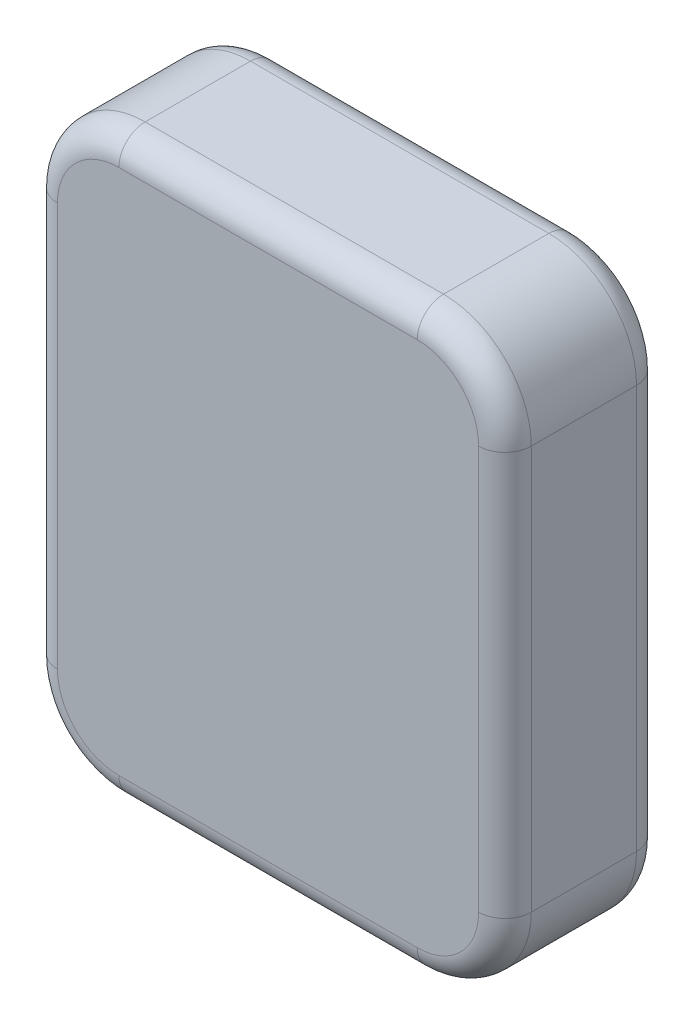
ISO-10303-21;
HEADER;
FILE_DESCRIPTION(('STEP AP214'),'2;1');
FILE_NAME('part.step','',(''),(''),'','','');
FILE_SCHEMA(('AUTOMOTIVE_DESIGN { 1 0 10303 214 1 1 1 1 }'));
ENDSEC;
DATA;
#1=APPLICATION_CONTEXT('core data for automotive mechanical design processes');
#2=APPLICATION_PROTOCOL_DEFINITION('international standard','automotive_design',2000,#1);
#3=PRODUCT_CONTEXT('',#1,'mechanical');
#4=PRODUCT('Part','Part','',(#3));
#5=PRODUCT_RELATED_PRODUCT_CATEGORY('part','',(#4));
#6=PRODUCT_DEFINITION_FORMATION('','',#4);
#7=PRODUCT_DEFINITION_CONTEXT('part definition',#1,'design');
#8=PRODUCT_DEFINITION('design','',#6,#7);
#9=PRODUCT_DEFINITION_SHAPE('','',#8);
#10=(LENGTH_UNIT() NAMED_UNIT(*) SI_UNIT(.MILLI.,.METRE.));
#11=(NAMED_UNIT(*) PLANE_ANGLE_UNIT() SI_UNIT($,.RADIAN.));
#12=(NAMED_UNIT(*) SI_UNIT($,.STERADIAN.) SOLID_ANGLE_UNIT());
#13=UNCERTAINTY_MEASURE_WITH_UNIT(LENGTH_MEASURE(1.E-05),#10,'distance_accuracy_value','');
#14=(GEOMETRIC_REPRESENTATION_CONTEXT(3) GLOBAL_UNCERTAINTY_ASSIGNED_CONTEXT((#13)) GLOBAL_UNIT_ASSIGNED_CONTEXT((#10,
#11,#12)) REPRESENTATION_CONTEXT('',''));
#15=CARTESIAN_POINT('',(0.,0.,0.));
#16=DIRECTION('',(0.,0.,1.));
#17=DIRECTION('',(1.,0.,0.));
#18=AXIS2_PLACEMENT_3D('',#15,#16,#17);
#19=CARTESIAN_POINT('',(0.,0.,18.));
#20=DIRECTION('',(1.,0.,0.));
#21=DIRECTION('',(0.,1.,0.));
#22=AXIS2_PLACEMENT_3D('',#19,#20,#21);
#23=PLANE('',#22);
#24=DIRECTION('',(0.,0.,-1.));
#25=VECTOR('',#24,1.);
#26=CARTESIAN_POINT('',(0.,56.,18.));
#27=LINE('',#26,#25);
#28=CARTESIAN_POINT('',(0.,56.,15.));
#29=VERTEX_POINT('',#28);
#30=CARTESIAN_POINT('',(0.,56.,3.));
#31=VERTEX_POINT('',#30);
#32=EDGE_CURVE('E344',#29,#31,#27,.T.);
#33=ORIENTED_EDGE('',*,*,#32,.T.);
#34=DIRECTION('',(0.,-1.,0.));
#35=VECTOR('',#34,1.);
#36=CARTESIAN_POINT('',(0.,10.,3.));
#37=LINE('',#36,#35);
#38=CARTESIAN_POINT('',(0.,10.,3.));
#39=VERTEX_POINT('',#38);
#40=EDGE_CURVE('E231',#31,#39,#37,.T.);
#41=ORIENTED_EDGE('',*,*,#40,.T.);
#42=DIRECTION('',(0.,0.,-1.));
#43=VECTOR('',#42,1.);
#44=CARTESIAN_POINT('',(0.,10.,18.));
#45=LINE('',#44,#43);
#46=CARTESIAN_POINT('',(0.,10.,15.));
#47=VERTEX_POINT('',#46);
#48=EDGE_CURVE('E350',#39,#47,#45,.F.);
#49=ORIENTED_EDGE('',*,*,#48,.T.);
#50=DIRECTION('',(0.,-1.,0.));
#51=VECTOR('',#50,1.);
#52=CARTESIAN_POINT('',(0.,0.,15.));
#53=LINE('',#52,#51);
#54=EDGE_CURVE('E228',#47,#29,#53,.F.);
#55=ORIENTED_EDGE('',*,*,#54,.T.);
#56=EDGE_LOOP('',(#33,#41,#49,#55));
#57=FACE_BOUND('',#56,.T.);
#58=ADVANCED_FACE('F49',(#57),#23,.F.);
#59=CARTESIAN_POINT('',(0.,0.,18.));
#60=DIRECTION('',(0.,1.,0.));
#61=DIRECTION('',(0.,0.,1.));
#62=AXIS2_PLACEMENT_3D('',#59,#60,#61);
#63=PLANE('',#62);
#64=DIRECTION('',(0.,0.,-1.));
#65=VECTOR('',#64,1.);
#66=CARTESIAN_POINT('',(10.,0.,18.));
#67=LINE('',#66,#65);
#68=CARTESIAN_POINT('',(10.,0.,15.));
#69=VERTEX_POINT('',#68);
#70=CARTESIAN_POINT('',(10.,0.,3.));
#71=VERTEX_POINT('',#70);
#72=EDGE_CURVE('E341',#69,#71,#67,.T.);
#73=ORIENTED_EDGE('',*,*,#72,.T.);
#74=DIRECTION('',(1.,0.,0.));
#75=VECTOR('',#74,1.);
#76=CARTESIAN_POINT('',(44.,0.,3.));
#77=LINE('',#76,#75);
#78=CARTESIAN_POINT('',(44.,0.,3.));
#79=VERTEX_POINT('',#78);
#80=EDGE_CURVE('E243',#71,#79,#77,.T.);
#81=ORIENTED_EDGE('',*,*,#80,.T.);
#82=DIRECTION('',(0.,0.,-1.));
#83=VECTOR('',#82,1.);
#84=CARTESIAN_POINT('',(44.,0.,18.));
#85=LINE('',#84,#83);
#86=CARTESIAN_POINT('',(44.,0.,15.));
#87=VERTEX_POINT('',#86);
#88=EDGE_CURVE('E289',#79,#87,#85,.F.);
#89=ORIENTED_EDGE('',*,*,#88,.T.);
#90=DIRECTION('',(1.,0.,0.));
#91=VECTOR('',#90,1.);
#92=CARTESIAN_POINT('',(0.,0.,15.));
#93=LINE('',#92,#91);
#94=EDGE_CURVE('E240',#87,#69,#93,.F.);
#95=ORIENTED_EDGE('',*,*,#94,.T.);
#96=EDGE_LOOP('',(#73,#81,#89,#95));
#97=FACE_BOUND('',#96,.T.);
#98=ADVANCED_FACE('F338',(#97),#63,.F.);
#99=CARTESIAN_POINT('',(54.,0.,18.));
#100=DIRECTION('',(-1.,0.,0.));
#101=DIRECTION('',(0.,-1.,0.));
#102=AXIS2_PLACEMENT_3D('',#99,#100,#101);
#103=PLANE('',#102);
#104=DIRECTION('',(0.,0.,-1.));
#105=VECTOR('',#104,1.);
#106=CARTESIAN_POINT('',(54.,10.,18.));
#107=LINE('',#106,#105);
#108=CARTESIAN_POINT('',(54.,10.,15.));
#109=VERTEX_POINT('',#108);
#110=CARTESIAN_POINT('',(54.,10.,3.));
#111=VERTEX_POINT('',#110);
#112=EDGE_CURVE('E335',#109,#111,#107,.T.);
#113=ORIENTED_EDGE('',*,*,#112,.T.);
#114=DIRECTION('',(0.,1.,0.));
#115=VECTOR('',#114,1.);
#116=CARTESIAN_POINT('',(54.,56.,3.));
#117=LINE('',#116,#115);
#118=CARTESIAN_POINT('',(54.,56.,3.));
#119=VERTEX_POINT('',#118);
#120=EDGE_CURVE('E206',#111,#119,#117,.T.);
#121=ORIENTED_EDGE('',*,*,#120,.T.);
#122=DIRECTION('',(0.,0.,-1.));
#123=VECTOR('',#122,1.);
#124=CARTESIAN_POINT('',(54.,56.,18.));
#125=LINE('',#124,#123);
#126=CARTESIAN_POINT('',(54.,56.,15.));
#127=VERTEX_POINT('',#126);
#128=EDGE_CURVE('E354',#119,#127,#125,.F.);
#129=ORIENTED_EDGE('',*,*,#128,.T.);
#130=DIRECTION('',(0.,1.,0.));
#131=VECTOR('',#130,1.);
#132=CARTESIAN_POINT('',(54.,0.,15.));
#133=LINE('',#132,#131);
#134=EDGE_CURVE('E203',#127,#109,#133,.F.);
#135=ORIENTED_EDGE('',*,*,#134,.T.);
#136=EDGE_LOOP('',(#113,#121,#129,#135));
#137=FACE_BOUND('',#136,.T.);
#138=ADVANCED_FACE('F390',(#137),#103,.F.);
#139=CARTESIAN_POINT('',(0.,66.,18.));
#140=DIRECTION('',(0.,-1.,0.));
#141=DIRECTION('',(0.,0.,-1.));
#142=AXIS2_PLACEMENT_3D('',#139,#140,#141);
#143=PLANE('',#142);
#144=DIRECTION('',(0.,0.,-1.));
#145=VECTOR('',#144,1.);
#146=CARTESIAN_POINT('',(44.,66.,18.));
#147=LINE('',#146,#145);
#148=CARTESIAN_POINT('',(44.,66.,15.));
#149=VERTEX_POINT('',#148);
#150=CARTESIAN_POINT('',(44.,66.,3.));
#151=VERTEX_POINT('',#150);
#152=EDGE_CURVE('E185',#149,#151,#147,.T.);
#153=ORIENTED_EDGE('',*,*,#152,.T.);
#154=DIRECTION('',(-1.,0.,0.));
#155=VECTOR('',#154,1.);
#156=CARTESIAN_POINT('',(9.99999999999999,66.,3.));
#157=LINE('',#156,#155);
#158=CARTESIAN_POINT('',(9.99999999999999,66.,3.));
#159=VERTEX_POINT('',#158);
#160=EDGE_CURVE('E218',#151,#159,#157,.T.);
#161=ORIENTED_EDGE('',*,*,#160,.T.);
#162=DIRECTION('',(0.,0.,-1.));
#163=VECTOR('',#162,1.);
#164=CARTESIAN_POINT('',(9.99999999999999,66.,18.));
#165=LINE('',#164,#163);
#166=CARTESIAN_POINT('',(9.99999999999999,66.,15.));
#167=VERTEX_POINT('',#166);
#168=EDGE_CURVE('E360',#159,#167,#165,.F.);
#169=ORIENTED_EDGE('',*,*,#168,.T.);
#170=DIRECTION('',(-1.,0.,0.));
#171=VECTOR('',#170,1.);
#172=CARTESIAN_POINT('',(0.,66.,15.));
#173=LINE('',#172,#171);
#174=EDGE_CURVE('E215',#167,#149,#173,.F.);
#175=ORIENTED_EDGE('',*,*,#174,.T.);
#176=EDGE_LOOP('',(#153,#161,#169,#175));
#177=FACE_BOUND('',#176,.T.);
#178=ADVANCED_FACE('F433',(#177),#143,.F.);
#179=CARTESIAN_POINT('',(0.,0.,18.));
#180=DIRECTION('',(0.,0.,-1.));
#181=DIRECTION('',(-1.,0.,0.));
#182=AXIS2_PLACEMENT_3D('',#179,#180,#181);
#183=PLANE('',#182);
#184=DIRECTION('',(-1.,0.,0.));
#185=VECTOR('',#184,1.);
#186=CARTESIAN_POINT('',(0.,63.,18.));
#187=LINE('',#186,#185);
#188=CARTESIAN_POINT('',(44.,63.,18.));
#189=VERTEX_POINT('',#188);
#190=CARTESIAN_POINT('',(9.99999999999999,63.,18.));
#191=VERTEX_POINT('',#190);
#192=EDGE_CURVE('E59',#189,#191,#187,.T.);
#193=ORIENTED_EDGE('',*,*,#192,.T.);
#194=CARTESIAN_POINT('',(9.99999999999999,56.,18.));
#195=DIRECTION('',(0.,0.,-1.));
#196=DIRECTION('',(-1.,0.,0.));
#197=AXIS2_PLACEMENT_3D('',#194,#195,#196);
#198=CIRCLE('',#197,7.);
#199=CARTESIAN_POINT('',(2.99999999999999,56.,18.));
#200=VERTEX_POINT('',#199);
#201=EDGE_CURVE('E11',#191,#200,#198,.F.);
#202=ORIENTED_EDGE('',*,*,#201,.T.);
#203=DIRECTION('',(0.,-1.,0.));
#204=VECTOR('',#203,1.);
#205=CARTESIAN_POINT('',(3.,0.,18.));
#206=LINE('',#205,#204);
#207=CARTESIAN_POINT('',(3.,10.,18.));
#208=VERTEX_POINT('',#207);
#209=EDGE_CURVE('E246',#200,#208,#206,.T.);
#210=ORIENTED_EDGE('',*,*,#209,.T.);
#211=CARTESIAN_POINT('',(10.,10.,18.));
#212=DIRECTION('',(0.,0.,-1.));
#213=DIRECTION('',(-1.,0.,0.));
#214=AXIS2_PLACEMENT_3D('',#211,#212,#213);
#215=CIRCLE('',#214,7.);
#216=CARTESIAN_POINT('',(10.,3.,18.));
#217=VERTEX_POINT('',#216);
#218=EDGE_CURVE('E249',#208,#217,#215,.F.);
#219=ORIENTED_EDGE('',*,*,#218,.T.);
#220=DIRECTION('',(1.,0.,0.));
#221=VECTOR('',#220,1.);
#222=CARTESIAN_POINT('',(0.,3.,18.));
#223=LINE('',#222,#221);
#224=CARTESIAN_POINT('',(44.,3.,18.));
#225=VERTEX_POINT('',#224);
#226=EDGE_CURVE('E252',#217,#225,#223,.T.);
#227=ORIENTED_EDGE('',*,*,#226,.T.);
#228=CARTESIAN_POINT('',(44.,10.,18.));
#229=DIRECTION('',(0.,0.,-1.));
#230=DIRECTION('',(-1.,0.,0.));
#231=AXIS2_PLACEMENT_3D('',#228,#229,#230);
#232=CIRCLE('',#231,7.);
#233=CARTESIAN_POINT('',(51.,10.,18.));
#234=VERTEX_POINT('',#233);
#235=EDGE_CURVE('E255',#225,#234,#232,.F.);
#236=ORIENTED_EDGE('',*,*,#235,.T.);
#237=DIRECTION('',(0.,1.,0.));
#238=VECTOR('',#237,1.);
#239=CARTESIAN_POINT('',(51.,0.,18.));
#240=LINE('',#239,#238);
#241=CARTESIAN_POINT('',(51.,56.,18.));
#242=VERTEX_POINT('',#241);
#243=EDGE_CURVE('E258',#234,#242,#240,.T.);
#244=ORIENTED_EDGE('',*,*,#243,.T.);
#245=CARTESIAN_POINT('',(44.,56.,18.));
#246=DIRECTION('',(0.,0.,-1.));
#247=DIRECTION('',(-1.,0.,0.));
#248=AXIS2_PLACEMENT_3D('',#245,#246,#247);
#249=CIRCLE('',#248,7.);
#250=EDGE_CURVE('E70',#242,#189,#249,.F.);
#251=ORIENTED_EDGE('',*,*,#250,.T.);
#252=EDGE_LOOP('',(#193,#202,#210,#219,#227,#236,#244,#251));
#253=FACE_BOUND('',#252,.T.);
#254=ADVANCED_FACE('F406',(#253),#183,.F.);
#255=CARTESIAN_POINT('',(0.,0.,0.));
#256=DIRECTION('',(0.,0.,-1.));
#257=DIRECTION('',(-1.,0.,0.));
#258=AXIS2_PLACEMENT_3D('',#255,#256,#257);
#259=PLANE('',#258);
#260=DIRECTION('',(0.,1.,0.));
#261=VECTOR('',#260,1.);
#262=CARTESIAN_POINT('',(51.,10.,0.));
#263=LINE('',#262,#261);
#264=CARTESIAN_POINT('',(51.,56.,0.));
#265=VERTEX_POINT('',#264);
#266=CARTESIAN_POINT('',(51.,10.,0.));
#267=VERTEX_POINT('',#266);
#268=EDGE_CURVE('E189',#265,#267,#263,.F.);
#269=ORIENTED_EDGE('',*,*,#268,.T.);
#270=CARTESIAN_POINT('',(44.,10.,0.));
#271=DIRECTION('',(0.,0.,-1.));
#272=DIRECTION('',(-1.,0.,0.));
#273=AXIS2_PLACEMENT_3D('',#270,#271,#272);
#274=CIRCLE('',#273,7.);
#275=CARTESIAN_POINT('',(44.,3.,0.));
#276=VERTEX_POINT('',#275);
#277=EDGE_CURVE('E168',#267,#276,#274,.T.);
#278=ORIENTED_EDGE('',*,*,#277,.T.);
#279=DIRECTION('',(1.,0.,0.));
#280=VECTOR('',#279,1.);
#281=CARTESIAN_POINT('',(10.,3.,0.));
#282=LINE('',#281,#280);
#283=CARTESIAN_POINT('',(10.,3.,0.));
#284=VERTEX_POINT('',#283);
#285=EDGE_CURVE('E177',#276,#284,#282,.F.);
#286=ORIENTED_EDGE('',*,*,#285,.T.);
#287=CARTESIAN_POINT('',(10.,10.,0.));
#288=DIRECTION('',(0.,0.,-1.));
#289=DIRECTION('',(-1.,0.,0.));
#290=AXIS2_PLACEMENT_3D('',#287,#288,#289);
#291=CIRCLE('',#290,7.);
#292=CARTESIAN_POINT('',(3.,10.,0.));
#293=VERTEX_POINT('',#292);
#294=EDGE_CURVE('E184',#284,#293,#291,.T.);
#295=ORIENTED_EDGE('',*,*,#294,.T.);
#296=DIRECTION('',(0.,-1.,0.));
#297=VECTOR('',#296,1.);
#298=CARTESIAN_POINT('',(2.99999999999999,56.,0.));
#299=LINE('',#298,#297);
#300=CARTESIAN_POINT('',(2.99999999999999,56.,0.));
#301=VERTEX_POINT('',#300);
#302=EDGE_CURVE('E369',#293,#301,#299,.F.);
#303=ORIENTED_EDGE('',*,*,#302,.T.);
#304=CARTESIAN_POINT('',(9.99999999999999,56.,0.));
#305=DIRECTION('',(0.,0.,-1.));
#306=DIRECTION('',(-1.,0.,0.));
#307=AXIS2_PLACEMENT_3D('',#304,#305,#306);
#308=CIRCLE('',#307,7.);
#309=CARTESIAN_POINT('',(9.99999999999999,63.,0.));
#310=VERTEX_POINT('',#309);
#311=EDGE_CURVE('E372',#301,#310,#308,.T.);
#312=ORIENTED_EDGE('',*,*,#311,.T.);
#313=DIRECTION('',(-1.,0.,0.));
#314=VECTOR('',#313,1.);
#315=CARTESIAN_POINT('',(44.,63.,0.));
#316=LINE('',#315,#314);
#317=CARTESIAN_POINT('',(44.,63.,0.));
#318=VERTEX_POINT('',#317);
#319=EDGE_CURVE('E375',#310,#318,#316,.F.);
#320=ORIENTED_EDGE('',*,*,#319,.T.);
#321=CARTESIAN_POINT('',(44.,56.,0.));
#322=DIRECTION('',(0.,0.,-1.));
#323=DIRECTION('',(-1.,0.,0.));
#324=AXIS2_PLACEMENT_3D('',#321,#322,#323);
#325=CIRCLE('',#324,7.);
#326=EDGE_CURVE('E197',#318,#265,#325,.T.);
#327=ORIENTED_EDGE('',*,*,#326,.T.);
#328=EDGE_LOOP('',(#269,#278,#286,#295,#303,#312,#320,#327));
#329=FACE_BOUND('',#328,.T.);
#330=ADVANCED_FACE('F187',(#329),#259,.T.);
#331=CARTESIAN_POINT('',(10.,10.,18.));
#332=DIRECTION('',(0.,0.,-1.));
#333=DIRECTION('',(-1.,0.,0.));
#334=AXIS2_PLACEMENT_3D('',#331,#332,#333);
#335=CYLINDRICAL_SURFACE('',#334,10.);
#336=ORIENTED_EDGE('',*,*,#48,.F.);
#337=CARTESIAN_POINT('',(10.,10.,3.));
#338=DIRECTION('',(0.,0.,-1.));
#339=DIRECTION('',(-1.,0.,0.));
#340=AXIS2_PLACEMENT_3D('',#337,#338,#339);
#341=CIRCLE('',#340,10.);
#342=EDGE_CURVE('E237',#39,#71,#341,.F.);
#343=ORIENTED_EDGE('',*,*,#342,.T.);
#344=ORIENTED_EDGE('',*,*,#72,.F.);
#345=CARTESIAN_POINT('',(10.,10.,15.));
#346=DIRECTION('',(0.,0.,-1.));
#347=DIRECTION('',(-1.,0.,0.));
#348=AXIS2_PLACEMENT_3D('',#345,#346,#347);
#349=CIRCLE('',#348,10.);
#350=EDGE_CURVE('E234',#69,#47,#349,.T.);
#351=ORIENTED_EDGE('',*,*,#350,.T.);
#352=EDGE_LOOP('',(#336,#343,#344,#351));
#353=FACE_BOUND('',#352,.T.);
#354=ADVANCED_FACE('F450',(#353),#335,.T.);
#355=CARTESIAN_POINT('',(44.,10.,18.));
#356=DIRECTION('',(0.,0.,-1.));
#357=DIRECTION('',(-1.,0.,0.));
#358=AXIS2_PLACEMENT_3D('',#355,#356,#357);
#359=CYLINDRICAL_SURFACE('',#358,10.);
#360=ORIENTED_EDGE('',*,*,#88,.F.);
#361=CARTESIAN_POINT('',(44.,10.,3.));
#362=DIRECTION('',(0.,0.,-1.));
#363=DIRECTION('',(-1.,0.,0.));
#364=AXIS2_PLACEMENT_3D('',#361,#362,#363);
#365=CIRCLE('',#364,10.);
#366=EDGE_CURVE('E170',#79,#111,#365,.F.);
#367=ORIENTED_EDGE('',*,*,#366,.T.);
#368=ORIENTED_EDGE('',*,*,#112,.F.);
#369=CARTESIAN_POINT('',(44.,10.,15.));
#370=DIRECTION('',(0.,0.,-1.));
#371=DIRECTION('',(-1.,0.,0.));
#372=AXIS2_PLACEMENT_3D('',#369,#370,#371);
#373=CIRCLE('',#372,10.);
#374=EDGE_CURVE('E192',#109,#87,#373,.T.);
#375=ORIENTED_EDGE('',*,*,#374,.T.);
#376=EDGE_LOOP('',(#360,#367,#368,#375));
#377=FACE_BOUND('',#376,.T.);
#378=ADVANCED_FACE('F333',(#377),#359,.T.);
#379=CARTESIAN_POINT('',(44.,56.,18.));
#380=DIRECTION('',(0.,0.,-1.));
#381=DIRECTION('',(-1.,0.,0.));
#382=AXIS2_PLACEMENT_3D('',#379,#380,#381);
#383=CYLINDRICAL_SURFACE('',#382,10.);
#384=ORIENTED_EDGE('',*,*,#128,.F.);
#385=CARTESIAN_POINT('',(44.,56.,3.));
#386=DIRECTION('',(0.,0.,-1.));
#387=DIRECTION('',(-1.,0.,0.));
#388=AXIS2_PLACEMENT_3D('',#385,#386,#387);
#389=CIRCLE('',#388,10.);
#390=EDGE_CURVE('E212',#119,#151,#389,.F.);
#391=ORIENTED_EDGE('',*,*,#390,.T.);
#392=ORIENTED_EDGE('',*,*,#152,.F.);
#393=CARTESIAN_POINT('',(44.,56.,15.));
#394=DIRECTION('',(0.,0.,-1.));
#395=DIRECTION('',(-1.,0.,0.));
#396=AXIS2_PLACEMENT_3D('',#393,#394,#395);
#397=CIRCLE('',#396,10.);
#398=EDGE_CURVE('E209',#149,#127,#397,.T.);
#399=ORIENTED_EDGE('',*,*,#398,.T.);
#400=EDGE_LOOP('',(#384,#391,#392,#399));
#401=FACE_BOUND('',#400,.T.);
#402=ADVANCED_FACE('F392',(#401),#383,.T.);
#403=CARTESIAN_POINT('',(9.99999999999999,56.,18.));
#404=DIRECTION('',(0.,0.,-1.));
#405=DIRECTION('',(-1.,0.,0.));
#406=AXIS2_PLACEMENT_3D('',#403,#404,#405);
#407=CYLINDRICAL_SURFACE('',#406,10.);
#408=ORIENTED_EDGE('',*,*,#168,.F.);
#409=CARTESIAN_POINT('',(9.99999999999999,56.,3.));
#410=DIRECTION('',(0.,0.,-1.));
#411=DIRECTION('',(-1.,0.,0.));
#412=AXIS2_PLACEMENT_3D('',#409,#410,#411);
#413=CIRCLE('',#412,10.);
#414=EDGE_CURVE('E225',#159,#31,#413,.F.);
#415=ORIENTED_EDGE('',*,*,#414,.T.);
#416=ORIENTED_EDGE('',*,*,#32,.F.);
#417=CARTESIAN_POINT('',(9.99999999999999,56.,15.));
#418=DIRECTION('',(0.,0.,-1.));
#419=DIRECTION('',(-1.,0.,0.));
#420=AXIS2_PLACEMENT_3D('',#417,#418,#419);
#421=CIRCLE('',#420,10.);
#422=EDGE_CURVE('E221',#29,#167,#421,.T.);
#423=ORIENTED_EDGE('',*,*,#422,.T.);
#424=EDGE_LOOP('',(#408,#415,#416,#423));
#425=FACE_BOUND('',#424,.T.);
#426=ADVANCED_FACE('F422',(#425),#407,.T.);
#427=CARTESIAN_POINT('',(9.99999999999999,56.,3.));
#428=DIRECTION('',(0.,0.,-1.));
#429=DIRECTION('',(-1.,0.,0.));
#430=AXIS2_PLACEMENT_3D('',#427,#428,#429);
#431=TOROIDAL_SURFACE('',#430,7.,3.);
#432=CARTESIAN_POINT('',(2.99999999999999,56.,3.));
#433=DIRECTION('',(0.,-1.,0.));
#434=DIRECTION('',(0.,0.,-1.));
#435=AXIS2_PLACEMENT_3D('',#432,#433,#434);
#436=CIRCLE('',#435,3.);
#437=EDGE_CURVE('E281',#31,#301,#436,.T.);
#438=ORIENTED_EDGE('',*,*,#437,.F.);
#439=ORIENTED_EDGE('',*,*,#414,.F.);
#440=CARTESIAN_POINT('',(9.99999999999999,63.,3.));
#441=DIRECTION('',(1.,0.,0.));
#442=DIRECTION('',(0.,0.,-1.));
#443=AXIS2_PLACEMENT_3D('',#440,#441,#442);
#444=CIRCLE('',#443,3.);
#445=EDGE_CURVE('E285',#310,#159,#444,.T.);
#446=ORIENTED_EDGE('',*,*,#445,.F.);
#447=ORIENTED_EDGE('',*,*,#311,.F.);
#448=EDGE_LOOP('',(#438,#439,#446,#447));
#449=FACE_BOUND('',#448,.T.);
#450=ADVANCED_FACE('F426',(#449),#431,.T.);
#451=CARTESIAN_POINT('',(0.,63.,3.));
#452=DIRECTION('',(1.,0.,0.));
#453=DIRECTION('',(0.,0.,-1.));
#454=AXIS2_PLACEMENT_3D('',#451,#452,#453);
#455=CYLINDRICAL_SURFACE('',#454,3.);
#456=ORIENTED_EDGE('',*,*,#445,.T.);
#457=ORIENTED_EDGE('',*,*,#160,.F.);
#458=CARTESIAN_POINT('',(44.,63.,3.));
#459=DIRECTION('',(1.,0.,0.));
#460=DIRECTION('',(0.,0.,-1.));
#461=AXIS2_PLACEMENT_3D('',#458,#459,#460);
#462=CIRCLE('',#461,3.);
#463=EDGE_CURVE('E277',#318,#151,#462,.T.);
#464=ORIENTED_EDGE('',*,*,#463,.F.);
#465=ORIENTED_EDGE('',*,*,#319,.F.);
#466=EDGE_LOOP('',(#456,#457,#464,#465));
#467=FACE_BOUND('',#466,.T.);
#468=ADVANCED_FACE('F431',(#467),#455,.T.);
#469=CARTESIAN_POINT('',(3.,0.,3.));
#470=DIRECTION('',(0.,1.,0.));
#471=DIRECTION('',(-1.,0.,0.));
#472=AXIS2_PLACEMENT_3D('',#469,#470,#471);
#473=CYLINDRICAL_SURFACE('',#472,3.);
#474=ORIENTED_EDGE('',*,*,#437,.T.);
#475=ORIENTED_EDGE('',*,*,#302,.F.);
#476=CARTESIAN_POINT('',(3.,10.,3.));
#477=DIRECTION('',(0.,-1.,0.));
#478=DIRECTION('',(0.,0.,-1.));
#479=AXIS2_PLACEMENT_3D('',#476,#477,#478);
#480=CIRCLE('',#479,3.);
#481=EDGE_CURVE('E273',#39,#293,#480,.T.);
#482=ORIENTED_EDGE('',*,*,#481,.F.);
#483=ORIENTED_EDGE('',*,*,#40,.F.);
#484=EDGE_LOOP('',(#474,#475,#482,#483));
#485=FACE_BOUND('',#484,.T.);
#486=ADVANCED_FACE('F472',(#485),#473,.T.);
#487=CARTESIAN_POINT('',(44.,56.,3.));
#488=DIRECTION('',(0.,0.,-1.));
#489=DIRECTION('',(-1.,0.,0.));
#490=AXIS2_PLACEMENT_3D('',#487,#488,#489);
#491=TOROIDAL_SURFACE('',#490,7.,3.);
#492=ORIENTED_EDGE('',*,*,#463,.T.);
#493=ORIENTED_EDGE('',*,*,#390,.F.);
#494=CARTESIAN_POINT('',(51.,56.,3.));
#495=DIRECTION('',(0.,-1.,0.));
#496=DIRECTION('',(0.,0.,-1.));
#497=AXIS2_PLACEMENT_3D('',#494,#495,#496);
#498=CIRCLE('',#497,3.);
#499=EDGE_CURVE('E269',#265,#119,#498,.T.);
#500=ORIENTED_EDGE('',*,*,#499,.F.);
#501=ORIENTED_EDGE('',*,*,#326,.F.);
#502=EDGE_LOOP('',(#492,#493,#500,#501));
#503=FACE_BOUND('',#502,.T.);
#504=ADVANCED_FACE('F384',(#503),#491,.T.);
#505=CARTESIAN_POINT('',(10.,10.,3.));
#506=DIRECTION('',(0.,0.,-1.));
#507=DIRECTION('',(-1.,0.,0.));
#508=AXIS2_PLACEMENT_3D('',#505,#506,#507);
#509=TOROIDAL_SURFACE('',#508,7.,3.);
#510=ORIENTED_EDGE('',*,*,#481,.T.);
#511=ORIENTED_EDGE('',*,*,#294,.F.);
#512=CARTESIAN_POINT('',(10.,3.,3.));
#513=DIRECTION('',(1.,0.,0.));
#514=DIRECTION('',(0.,0.,-1.));
#515=AXIS2_PLACEMENT_3D('',#512,#513,#514);
#516=CIRCLE('',#515,3.);
#517=EDGE_CURVE('E180',#71,#284,#516,.T.);
#518=ORIENTED_EDGE('',*,*,#517,.F.);
#519=ORIENTED_EDGE('',*,*,#342,.F.);
#520=EDGE_LOOP('',(#510,#511,#518,#519));
#521=FACE_BOUND('',#520,.T.);
#522=ADVANCED_FACE('F466',(#521),#509,.T.);
#523=CARTESIAN_POINT('',(51.,0.,3.));
#524=DIRECTION('',(0.,-1.,0.));
#525=DIRECTION('',(1.,0.,0.));
#526=AXIS2_PLACEMENT_3D('',#523,#524,#525);
#527=CYLINDRICAL_SURFACE('',#526,3.);
#528=ORIENTED_EDGE('',*,*,#499,.T.);
#529=ORIENTED_EDGE('',*,*,#120,.F.);
#530=CARTESIAN_POINT('',(51.,10.,3.));
#531=DIRECTION('',(0.,-1.,0.));
#532=DIRECTION('',(0.,0.,-1.));
#533=AXIS2_PLACEMENT_3D('',#530,#531,#532);
#534=CIRCLE('',#533,3.);
#535=EDGE_CURVE('E174',#267,#111,#534,.T.);
#536=ORIENTED_EDGE('',*,*,#535,.F.);
#537=ORIENTED_EDGE('',*,*,#268,.F.);
#538=EDGE_LOOP('',(#528,#529,#536,#537));
#539=FACE_BOUND('',#538,.T.);
#540=ADVANCED_FACE('F387',(#539),#527,.T.);
#541=CARTESIAN_POINT('',(0.,3.,3.));
#542=DIRECTION('',(-1.,0.,0.));
#543=DIRECTION('',(0.,0.,1.));
#544=AXIS2_PLACEMENT_3D('',#541,#542,#543);
#545=CYLINDRICAL_SURFACE('',#544,3.);
#546=ORIENTED_EDGE('',*,*,#517,.T.);
#547=ORIENTED_EDGE('',*,*,#285,.F.);
#548=CARTESIAN_POINT('',(44.,3.,3.));
#549=DIRECTION('',(1.,0.,0.));
#550=DIRECTION('',(0.,0.,-1.));
#551=AXIS2_PLACEMENT_3D('',#548,#549,#550);
#552=CIRCLE('',#551,3.);
#553=EDGE_CURVE('E164',#79,#276,#552,.T.);
#554=ORIENTED_EDGE('',*,*,#553,.F.);
#555=ORIENTED_EDGE('',*,*,#80,.F.);
#556=EDGE_LOOP('',(#546,#547,#554,#555));
#557=FACE_BOUND('',#556,.T.);
#558=ADVANCED_FACE('F178',(#557),#545,.T.);
#559=CARTESIAN_POINT('',(44.,10.,3.));
#560=DIRECTION('',(0.,0.,-1.));
#561=DIRECTION('',(-1.,0.,0.));
#562=AXIS2_PLACEMENT_3D('',#559,#560,#561);
#563=TOROIDAL_SURFACE('',#562,7.,3.);
#564=ORIENTED_EDGE('',*,*,#535,.T.);
#565=ORIENTED_EDGE('',*,*,#366,.F.);
#566=ORIENTED_EDGE('',*,*,#553,.T.);
#567=ORIENTED_EDGE('',*,*,#277,.F.);
#568=EDGE_LOOP('',(#564,#565,#566,#567));
#569=FACE_BOUND('',#568,.T.);
#570=ADVANCED_FACE('F166',(#569),#563,.T.);
#571=CARTESIAN_POINT('',(44.,10.,15.));
#572=DIRECTION('',(0.,0.,-1.));
#573=DIRECTION('',(-1.,0.,0.));
#574=AXIS2_PLACEMENT_3D('',#571,#572,#573);
#575=TOROIDAL_SURFACE('',#574,7.,3.);
#576=CARTESIAN_POINT('',(44.,3.,15.));
#577=DIRECTION('',(-1.,0.,0.));
#578=DIRECTION('',(0.,0.,1.));
#579=AXIS2_PLACEMENT_3D('',#576,#577,#578);
#580=CIRCLE('',#579,3.);
#581=EDGE_CURVE('E311',#87,#225,#580,.T.);
#582=ORIENTED_EDGE('',*,*,#581,.F.);
#583=ORIENTED_EDGE('',*,*,#374,.F.);
#584=CARTESIAN_POINT('',(51.,10.,15.));
#585=DIRECTION('',(0.,1.,0.));
#586=DIRECTION('',(0.,0.,1.));
#587=AXIS2_PLACEMENT_3D('',#584,#585,#586);
#588=CIRCLE('',#587,3.);
#589=EDGE_CURVE('E53',#234,#109,#588,.T.);
#590=ORIENTED_EDGE('',*,*,#589,.F.);
#591=ORIENTED_EDGE('',*,*,#235,.F.);
#592=EDGE_LOOP('',(#582,#583,#590,#591));
#593=FACE_BOUND('',#592,.T.);
#594=ADVANCED_FACE('F51',(#593),#575,.T.);
#595=CARTESIAN_POINT('',(51.,0.,15.));
#596=DIRECTION('',(0.,1.,0.));
#597=DIRECTION('',(-1.,0.,0.));
#598=AXIS2_PLACEMENT_3D('',#595,#596,#597);
#599=CYLINDRICAL_SURFACE('',#598,3.);
#600=ORIENTED_EDGE('',*,*,#589,.T.);
#601=ORIENTED_EDGE('',*,*,#134,.F.);
#602=CARTESIAN_POINT('',(51.,56.,15.));
#603=DIRECTION('',(0.,1.,0.));
#604=DIRECTION('',(0.,0.,1.));
#605=AXIS2_PLACEMENT_3D('',#602,#603,#604);
#606=CIRCLE('',#605,3.);
#607=EDGE_CURVE('E308',#242,#127,#606,.T.);
#608=ORIENTED_EDGE('',*,*,#607,.F.);
#609=ORIENTED_EDGE('',*,*,#243,.F.);
#610=EDGE_LOOP('',(#600,#601,#608,#609));
#611=FACE_BOUND('',#610,.T.);
#612=ADVANCED_FACE('F324',(#611),#599,.T.);
#613=CARTESIAN_POINT('',(0.,3.,15.));
#614=DIRECTION('',(1.,0.,0.));
#615=DIRECTION('',(0.,0.,-1.));
#616=AXIS2_PLACEMENT_3D('',#613,#614,#615);
#617=CYLINDRICAL_SURFACE('',#616,3.);
#618=ORIENTED_EDGE('',*,*,#581,.T.);
#619=ORIENTED_EDGE('',*,*,#226,.F.);
#620=CARTESIAN_POINT('',(10.,3.,15.));
#621=DIRECTION('',(-1.,0.,0.));
#622=DIRECTION('',(0.,0.,1.));
#623=AXIS2_PLACEMENT_3D('',#620,#621,#622);
#624=CIRCLE('',#623,3.);
#625=EDGE_CURVE('E304',#69,#217,#624,.T.);
#626=ORIENTED_EDGE('',*,*,#625,.F.);
#627=ORIENTED_EDGE('',*,*,#94,.F.);
#628=EDGE_LOOP('',(#618,#619,#626,#627));
#629=FACE_BOUND('',#628,.T.);
#630=ADVANCED_FACE('F490',(#629),#617,.T.);
#631=CARTESIAN_POINT('',(44.,56.,15.));
#632=DIRECTION('',(0.,0.,-1.));
#633=DIRECTION('',(-1.,0.,0.));
#634=AXIS2_PLACEMENT_3D('',#631,#632,#633);
#635=TOROIDAL_SURFACE('',#634,7.,3.);
#636=ORIENTED_EDGE('',*,*,#607,.T.);
#637=ORIENTED_EDGE('',*,*,#398,.F.);
#638=CARTESIAN_POINT('',(44.,63.,15.));
#639=DIRECTION('',(-1.,0.,0.));
#640=DIRECTION('',(0.,0.,1.));
#641=AXIS2_PLACEMENT_3D('',#638,#639,#640);
#642=CIRCLE('',#641,3.);
#643=EDGE_CURVE('E300',#189,#149,#642,.T.);
#644=ORIENTED_EDGE('',*,*,#643,.F.);
#645=ORIENTED_EDGE('',*,*,#250,.F.);
#646=EDGE_LOOP('',(#636,#637,#644,#645));
#647=FACE_BOUND('',#646,.T.);
#648=ADVANCED_FACE('F396',(#647),#635,.T.);
#649=CARTESIAN_POINT('',(10.,10.,15.));
#650=DIRECTION('',(0.,0.,-1.));
#651=DIRECTION('',(-1.,0.,0.));
#652=AXIS2_PLACEMENT_3D('',#649,#650,#651);
#653=TOROIDAL_SURFACE('',#652,7.,3.);
#654=ORIENTED_EDGE('',*,*,#625,.T.);
#655=ORIENTED_EDGE('',*,*,#218,.F.);
#656=CARTESIAN_POINT('',(3.,10.,15.));
#657=DIRECTION('',(0.,1.,0.));
#658=DIRECTION('',(0.,0.,1.));
#659=AXIS2_PLACEMENT_3D('',#656,#657,#658);
#660=CIRCLE('',#659,3.);
#661=EDGE_CURVE('E296',#47,#208,#660,.T.);
#662=ORIENTED_EDGE('',*,*,#661,.F.);
#663=ORIENTED_EDGE('',*,*,#350,.F.);
#664=EDGE_LOOP('',(#654,#655,#662,#663));
#665=FACE_BOUND('',#664,.T.);
#666=ADVANCED_FACE('F411',(#665),#653,.T.);
#667=CARTESIAN_POINT('',(0.,63.,15.));
#668=DIRECTION('',(-1.,0.,0.));
#669=DIRECTION('',(0.,0.,1.));
#670=AXIS2_PLACEMENT_3D('',#667,#668,#669);
#671=CYLINDRICAL_SURFACE('',#670,3.);
#672=ORIENTED_EDGE('',*,*,#643,.T.);
#673=ORIENTED_EDGE('',*,*,#174,.F.);
#674=CARTESIAN_POINT('',(9.99999999999999,63.,15.));
#675=DIRECTION('',(-1.,0.,0.));
#676=DIRECTION('',(0.,0.,1.));
#677=AXIS2_PLACEMENT_3D('',#674,#675,#676);
#678=CIRCLE('',#677,3.);
#679=EDGE_CURVE('E293',#191,#167,#678,.T.);
#680=ORIENTED_EDGE('',*,*,#679,.F.);
#681=ORIENTED_EDGE('',*,*,#192,.F.);
#682=EDGE_LOOP('',(#672,#673,#680,#681));
#683=FACE_BOUND('',#682,.T.);
#684=ADVANCED_FACE('F399',(#683),#671,.T.);
#685=CARTESIAN_POINT('',(3.,0.,15.));
#686=DIRECTION('',(0.,-1.,0.));
#687=DIRECTION('',(1.,0.,0.));
#688=AXIS2_PLACEMENT_3D('',#685,#686,#687);
#689=CYLINDRICAL_SURFACE('',#688,3.);
#690=ORIENTED_EDGE('',*,*,#661,.T.);
#691=ORIENTED_EDGE('',*,*,#209,.F.);
#692=CARTESIAN_POINT('',(2.99999999999999,56.,15.));
#693=DIRECTION('',(0.,1.,0.));
#694=DIRECTION('',(0.,0.,1.));
#695=AXIS2_PLACEMENT_3D('',#692,#693,#694);
#696=CIRCLE('',#695,3.);
#697=EDGE_CURVE('E290',#29,#200,#696,.T.);
#698=ORIENTED_EDGE('',*,*,#697,.F.);
#699=ORIENTED_EDGE('',*,*,#54,.F.);
#700=EDGE_LOOP('',(#690,#691,#698,#699));
#701=FACE_BOUND('',#700,.T.);
#702=ADVANCED_FACE('F415',(#701),#689,.T.);
#703=CARTESIAN_POINT('',(9.99999999999999,56.,15.));
#704=DIRECTION('',(0.,0.,-1.));
#705=DIRECTION('',(-1.,0.,0.));
#706=AXIS2_PLACEMENT_3D('',#703,#704,#705);
#707=TOROIDAL_SURFACE('',#706,7.,3.);
#708=ORIENTED_EDGE('',*,*,#679,.T.);
#709=ORIENTED_EDGE('',*,*,#422,.F.);
#710=ORIENTED_EDGE('',*,*,#697,.T.);
#711=ORIENTED_EDGE('',*,*,#201,.F.);
#712=EDGE_LOOP('',(#708,#709,#710,#711));
#713=FACE_BOUND('',#712,.T.);
#714=ADVANCED_FACE('F403',(#713),#707,.T.);
#715=CLOSED_SHELL('',(#58,#98,#138,#178,#254,#330,#354,#378,#402,#426,#450,#468,#486,#504,#522,
#540,#558,#570,#594,#612,#630,#648,#666,#684,#702,#714));
#716=MANIFOLD_SOLID_BREP('B2',#715);
#717=ADVANCED_BREP_SHAPE_REPRESENTATION('',(#18,#716),#14);
#718=SHAPE_DEFINITION_REPRESENTATION(#9,#717);
ENDSEC;
END-ISO-10303-21;
